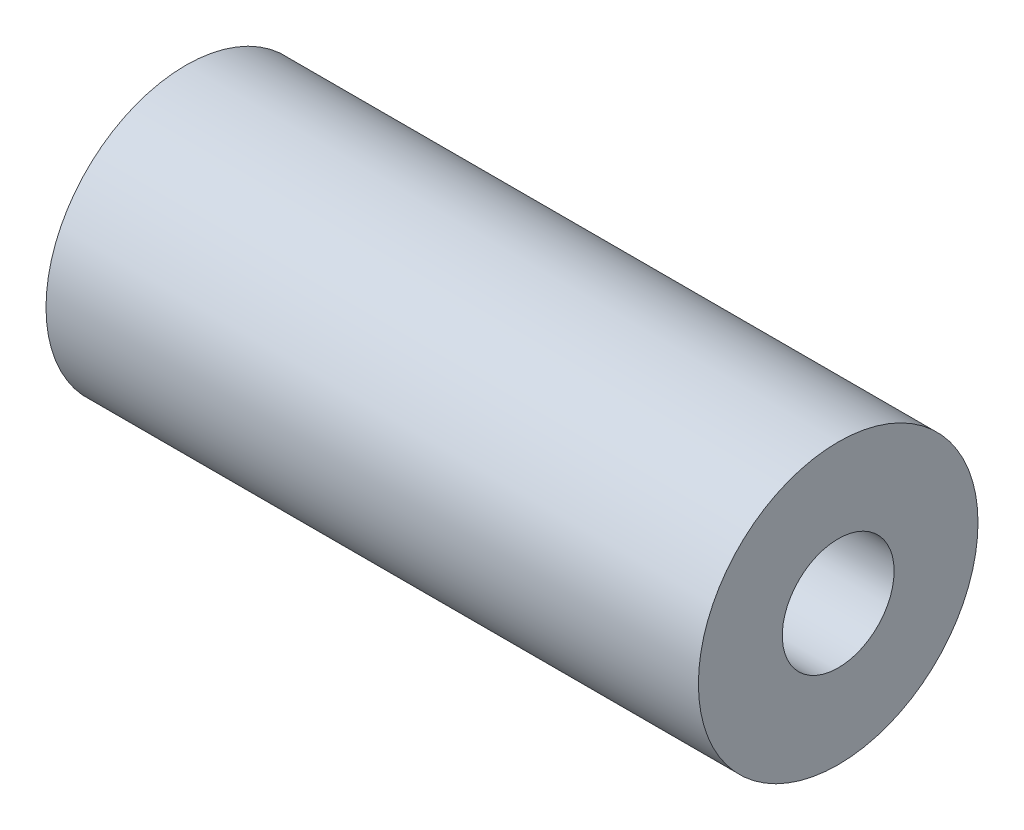
ISO-10303-21;
HEADER;
FILE_DESCRIPTION(('STEP AP214'),'2;1');
FILE_NAME('part.step','',(''),(''),'','','');
FILE_SCHEMA(('AUTOMOTIVE_DESIGN { 1 0 10303 214 1 1 1 1 }'));
ENDSEC;
DATA;
#1=APPLICATION_CONTEXT('core data for automotive mechanical design processes');
#2=APPLICATION_PROTOCOL_DEFINITION('international standard','automotive_design',2000,#1);
#3=PRODUCT_CONTEXT('',#1,'mechanical');
#4=PRODUCT('Part','Part','',(#3));
#5=PRODUCT_RELATED_PRODUCT_CATEGORY('part','',(#4));
#6=PRODUCT_DEFINITION_FORMATION('','',#4);
#7=PRODUCT_DEFINITION_CONTEXT('part definition',#1,'design');
#8=PRODUCT_DEFINITION('design','',#6,#7);
#9=PRODUCT_DEFINITION_SHAPE('','',#8);
#10=(LENGTH_UNIT() NAMED_UNIT(*) SI_UNIT(.MILLI.,.METRE.));
#11=(NAMED_UNIT(*) PLANE_ANGLE_UNIT() SI_UNIT($,.RADIAN.));
#12=(NAMED_UNIT(*) SI_UNIT($,.STERADIAN.) SOLID_ANGLE_UNIT());
#13=UNCERTAINTY_MEASURE_WITH_UNIT(LENGTH_MEASURE(1.E-05),#10,'distance_accuracy_value','');
#14=(GEOMETRIC_REPRESENTATION_CONTEXT(3) GLOBAL_UNCERTAINTY_ASSIGNED_CONTEXT((#13)) GLOBAL_UNIT_ASSIGNED_CONTEXT((#10,
#11,#12)) REPRESENTATION_CONTEXT('',''));
#15=CARTESIAN_POINT('',(0.,0.,0.));
#16=DIRECTION('',(0.,0.,1.));
#17=DIRECTION('',(1.,0.,0.));
#18=AXIS2_PLACEMENT_3D('',#15,#16,#17);
#19=CARTESIAN_POINT('',(280.,0.,0.));
#20=DIRECTION('',(1.,0.,0.));
#21=DIRECTION('',(0.,0.,-1.));
#22=AXIS2_PLACEMENT_3D('',#19,#20,#21);
#23=PLANE('',#22);
#24=CARTESIAN_POINT('',(280.,0.,0.));
#25=DIRECTION('',(1.,0.,0.));
#26=DIRECTION('',(0.,0.,-1.));
#27=AXIS2_PLACEMENT_3D('',#24,#25,#26);
#28=CIRCLE('',#27,60.);
#29=CARTESIAN_POINT('',(280.,0.,-60.));
#30=VERTEX_POINT('',#29);
#31=EDGE_CURVE('E10',#30,#30,#28,.T.);
#32=ORIENTED_EDGE('',*,*,#31,.T.);
#33=EDGE_LOOP('',(#32));
#34=FACE_BOUND('',#33,.T.);
#35=CARTESIAN_POINT('',(280.,0.,0.));
#36=DIRECTION('',(1.,0.,0.));
#37=DIRECTION('',(0.,0.,-1.));
#38=AXIS2_PLACEMENT_3D('',#35,#36,#37);
#39=CIRCLE('',#38,24.);
#40=CARTESIAN_POINT('',(280.,0.,-24.));
#41=VERTEX_POINT('',#40);
#42=EDGE_CURVE('E42',#41,#41,#39,.T.);
#43=ORIENTED_EDGE('',*,*,#42,.F.);
#44=EDGE_LOOP('',(#43));
#45=FACE_BOUND('',#44,.T.);
#46=ADVANCED_FACE('F31',(#34,#45),#23,.T.);
#47=CARTESIAN_POINT('',(0.,0.,0.));
#48=DIRECTION('',(1.,0.,0.));
#49=DIRECTION('',(0.,0.,-1.));
#50=AXIS2_PLACEMENT_3D('',#47,#48,#49);
#51=PLANE('',#50);
#52=CARTESIAN_POINT('',(0.,0.,0.));
#53=DIRECTION('',(1.,0.,0.));
#54=DIRECTION('',(0.,0.,-1.));
#55=AXIS2_PLACEMENT_3D('',#52,#53,#54);
#56=CIRCLE('',#55,60.);
#57=CARTESIAN_POINT('',(0.,0.,-60.));
#58=VERTEX_POINT('',#57);
#59=EDGE_CURVE('E35',#58,#58,#56,.T.);
#60=ORIENTED_EDGE('',*,*,#59,.F.);
#61=EDGE_LOOP('',(#60));
#62=FACE_BOUND('',#61,.T.);
#63=CARTESIAN_POINT('',(0.,0.,0.));
#64=DIRECTION('',(1.,0.,0.));
#65=DIRECTION('',(0.,0.,-1.));
#66=AXIS2_PLACEMENT_3D('',#63,#64,#65);
#67=CIRCLE('',#66,24.);
#68=CARTESIAN_POINT('',(0.,0.,-24.));
#69=VERTEX_POINT('',#68);
#70=EDGE_CURVE('E44',#69,#69,#67,.T.);
#71=ORIENTED_EDGE('',*,*,#70,.T.);
#72=EDGE_LOOP('',(#71));
#73=FACE_BOUND('',#72,.T.);
#74=ADVANCED_FACE('F54',(#62,#73),#51,.F.);
#75=CARTESIAN_POINT('',(280.,0.,0.));
#76=DIRECTION('',(-1.,0.,0.));
#77=DIRECTION('',(0.,0.,1.));
#78=AXIS2_PLACEMENT_3D('',#75,#76,#77);
#79=CYLINDRICAL_SURFACE('',#78,60.);
#80=ORIENTED_EDGE('',*,*,#31,.F.);
#81=EDGE_LOOP('',(#80));
#82=FACE_BOUND('',#81,.T.);
#83=ORIENTED_EDGE('',*,*,#59,.T.);
#84=EDGE_LOOP('',(#83));
#85=FACE_BOUND('',#84,.T.);
#86=ADVANCED_FACE('F33',(#82,#85),#79,.T.);
#87=CARTESIAN_POINT('',(280.,0.,0.));
#88=DIRECTION('',(-1.,0.,0.));
#89=DIRECTION('',(0.,0.,1.));
#90=AXIS2_PLACEMENT_3D('',#87,#88,#89);
#91=CYLINDRICAL_SURFACE('',#90,24.);
#92=ORIENTED_EDGE('',*,*,#42,.T.);
#93=EDGE_LOOP('',(#92));
#94=FACE_BOUND('',#93,.T.);
#95=ORIENTED_EDGE('',*,*,#70,.F.);
#96=EDGE_LOOP('',(#95));
#97=FACE_BOUND('',#96,.T.);
#98=ADVANCED_FACE('F50',(#94,#97),#91,.F.);
#99=CLOSED_SHELL('',(#46,#74,#86,#98));
#100=MANIFOLD_SOLID_BREP('B2',#99);
#101=ADVANCED_BREP_SHAPE_REPRESENTATION('',(#18,#100),#14);
#102=SHAPE_DEFINITION_REPRESENTATION(#9,#101);
ENDSEC;
END-ISO-10303-21;
